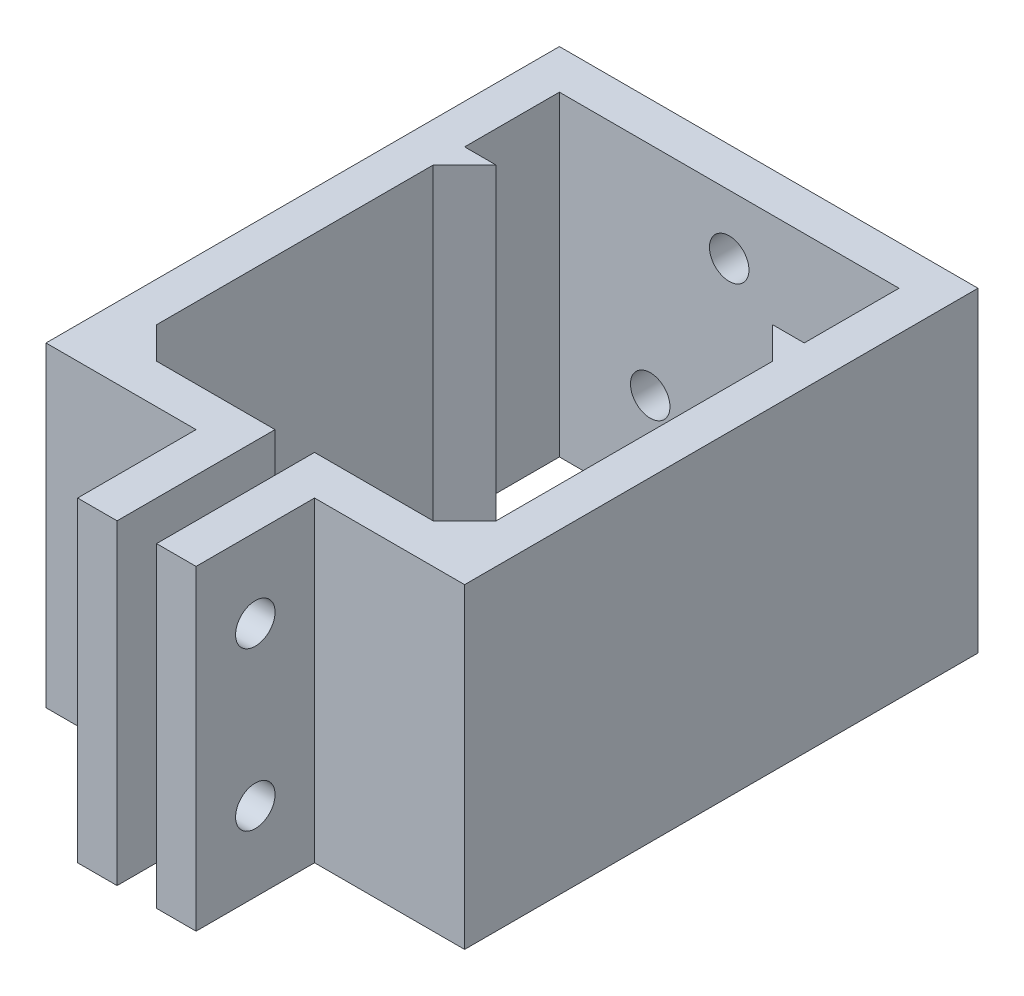
ISO-10303-21;
HEADER;
FILE_DESCRIPTION(('STEP AP214'),'2;1');
FILE_NAME('part.step','',(''),(''),'','','');
FILE_SCHEMA(('AUTOMOTIVE_DESIGN { 1 0 10303 214 1 1 1 1 }'));
ENDSEC;
DATA;
#1=APPLICATION_CONTEXT('core data for automotive mechanical design processes');
#2=APPLICATION_PROTOCOL_DEFINITION('international standard','automotive_design',2000,#1);
#3=PRODUCT_CONTEXT('',#1,'mechanical');
#4=PRODUCT('Part','Part','',(#3));
#5=PRODUCT_RELATED_PRODUCT_CATEGORY('part','',(#4));
#6=PRODUCT_DEFINITION_FORMATION('','',#4);
#7=PRODUCT_DEFINITION_CONTEXT('part definition',#1,'design');
#8=PRODUCT_DEFINITION('design','',#6,#7);
#9=PRODUCT_DEFINITION_SHAPE('','',#8);
#10=(LENGTH_UNIT() NAMED_UNIT(*) SI_UNIT(.MILLI.,.METRE.));
#11=(NAMED_UNIT(*) PLANE_ANGLE_UNIT() SI_UNIT($,.RADIAN.));
#12=(NAMED_UNIT(*) SI_UNIT($,.STERADIAN.) SOLID_ANGLE_UNIT());
#13=UNCERTAINTY_MEASURE_WITH_UNIT(LENGTH_MEASURE(1.E-05),#10,'distance_accuracy_value','');
#14=(GEOMETRIC_REPRESENTATION_CONTEXT(3) GLOBAL_UNCERTAINTY_ASSIGNED_CONTEXT((#13)) GLOBAL_UNIT_ASSIGNED_CONTEXT((#10,
#11,#12)) REPRESENTATION_CONTEXT('',''));
#15=CARTESIAN_POINT('',(0.,0.,0.));
#16=DIRECTION('',(0.,0.,1.));
#17=DIRECTION('',(1.,0.,0.));
#18=AXIS2_PLACEMENT_3D('',#15,#16,#17);
#19=CARTESIAN_POINT('',(48.,40.,-5.));
#20=DIRECTION('',(1.,0.,0.));
#21=DIRECTION('',(0.,0.,-1.));
#22=AXIS2_PLACEMENT_3D('',#19,#20,#21);
#23=PLANE('',#22);
#24=DIRECTION('',(0.,-1.,0.));
#25=VECTOR('',#24,1.);
#26=CARTESIAN_POINT('',(48.,40.,-48.));
#27=LINE('',#26,#25);
#28=CARTESIAN_POINT('',(48.,40.,-48.));
#29=VERTEX_POINT('',#28);
#30=CARTESIAN_POINT('',(48.,0.,-48.));
#31=VERTEX_POINT('',#30);
#32=EDGE_CURVE('E54',#29,#31,#27,.T.);
#33=ORIENTED_EDGE('',*,*,#32,.F.);
#34=DIRECTION('',(0.,0.,1.));
#35=VECTOR('',#34,1.);
#36=CARTESIAN_POINT('',(48.,40.,-5.));
#37=LINE('',#36,#35);
#38=CARTESIAN_POINT('',(48.,40.,-60.));
#39=VERTEX_POINT('',#38);
#40=EDGE_CURVE('E207',#39,#29,#37,.T.);
#41=ORIENTED_EDGE('',*,*,#40,.F.);
#42=DIRECTION('',(0.,-1.,0.));
#43=VECTOR('',#42,1.);
#44=CARTESIAN_POINT('',(48.,40.,-60.));
#45=LINE('',#44,#43);
#46=CARTESIAN_POINT('',(48.,0.,-60.));
#47=VERTEX_POINT('',#46);
#48=EDGE_CURVE('E351',#39,#47,#45,.T.);
#49=ORIENTED_EDGE('',*,*,#48,.T.);
#50=DIRECTION('',(0.,0.,1.));
#51=VECTOR('',#50,1.);
#52=CARTESIAN_POINT('',(48.,0.,-5.));
#53=LINE('',#52,#51);
#54=EDGE_CURVE('E311',#47,#31,#53,.T.);
#55=ORIENTED_EDGE('',*,*,#54,.T.);
#56=EDGE_LOOP('',(#33,#41,#49,#55));
#57=FACE_BOUND('',#56,.T.);
#58=ADVANCED_FACE('F31',(#57),#23,.F.);
#59=DIRECTION('',(0.,-1.,0.));
#60=VECTOR('',#59,1.);
#61=CARTESIAN_POINT('',(48.,40.,-44.));
#62=LINE('',#61,#60);
#63=CARTESIAN_POINT('',(48.,40.,-44.));
#64=VERTEX_POINT('',#63);
#65=CARTESIAN_POINT('',(48.,0.,-44.));
#66=VERTEX_POINT('',#65);
#67=EDGE_CURVE('E200',#64,#66,#62,.T.);
#68=ORIENTED_EDGE('',*,*,#67,.T.);
#69=CARTESIAN_POINT('',(48.,0.,-8.99999999999999));
#70=VERTEX_POINT('',#69);
#71=EDGE_CURVE('E310',#66,#70,#53,.T.);
#72=ORIENTED_EDGE('',*,*,#71,.T.);
#73=DIRECTION('',(0.,1.,0.));
#74=VECTOR('',#73,1.);
#75=CARTESIAN_POINT('',(48.,40.,-8.99999999999999));
#76=LINE('',#75,#74);
#77=CARTESIAN_POINT('',(48.,40.,-8.99999999999999));
#78=VERTEX_POINT('',#77);
#79=EDGE_CURVE('E372',#70,#78,#76,.T.);
#80=ORIENTED_EDGE('',*,*,#79,.T.);
#81=EDGE_CURVE('E46',#64,#78,#37,.T.);
#82=ORIENTED_EDGE('',*,*,#81,.F.);
#83=EDGE_LOOP('',(#68,#72,#80,#82));
#84=FACE_BOUND('',#83,.T.);
#85=ADVANCED_FACE('F418',(#84),#23,.F.);
#86=CARTESIAN_POINT('',(5.,40.,-60.));
#87=DIRECTION('',(-1.,0.,0.));
#88=DIRECTION('',(0.,0.,1.));
#89=AXIS2_PLACEMENT_3D('',#86,#87,#88);
#90=PLANE('',#89);
#91=DIRECTION('',(0.,-1.,0.));
#92=VECTOR('',#91,1.);
#93=CARTESIAN_POINT('',(5.,40.,-44.));
#94=LINE('',#93,#92);
#95=CARTESIAN_POINT('',(5.,40.,-44.));
#96=VERTEX_POINT('',#95);
#97=CARTESIAN_POINT('',(5.,0.,-44.));
#98=VERTEX_POINT('',#97);
#99=EDGE_CURVE('E227',#96,#98,#94,.T.);
#100=ORIENTED_EDGE('',*,*,#99,.F.);
#101=DIRECTION('',(0.,0.,-1.));
#102=VECTOR('',#101,1.);
#103=CARTESIAN_POINT('',(5.,40.,-60.));
#104=LINE('',#103,#102);
#105=CARTESIAN_POINT('',(5.,40.,-9.00000000000004));
#106=VERTEX_POINT('',#105);
#107=EDGE_CURVE('E271',#106,#96,#104,.T.);
#108=ORIENTED_EDGE('',*,*,#107,.F.);
#109=DIRECTION('',(0.,-1.,0.));
#110=VECTOR('',#109,1.);
#111=CARTESIAN_POINT('',(5.,0.,-9.00000000000004));
#112=LINE('',#111,#110);
#113=CARTESIAN_POINT('',(5.,0.,-9.00000000000004));
#114=VERTEX_POINT('',#113);
#115=EDGE_CURVE('E374',#106,#114,#112,.T.);
#116=ORIENTED_EDGE('',*,*,#115,.T.);
#117=DIRECTION('',(0.,0.,-1.));
#118=VECTOR('',#117,1.);
#119=CARTESIAN_POINT('',(5.,0.,-60.));
#120=LINE('',#119,#118);
#121=EDGE_CURVE('E306',#114,#98,#120,.T.);
#122=ORIENTED_EDGE('',*,*,#121,.T.);
#123=EDGE_LOOP('',(#100,#108,#116,#122));
#124=FACE_BOUND('',#123,.T.);
#125=ADVANCED_FACE('F401',(#124),#90,.F.);
#126=DIRECTION('',(0.,-1.,0.));
#127=VECTOR('',#126,1.);
#128=CARTESIAN_POINT('',(5.,40.,-48.));
#129=LINE('',#128,#127);
#130=CARTESIAN_POINT('',(5.,40.,-48.));
#131=VERTEX_POINT('',#130);
#132=CARTESIAN_POINT('',(5.,0.,-48.));
#133=VERTEX_POINT('',#132);
#134=EDGE_CURVE('E233',#131,#133,#129,.T.);
#135=ORIENTED_EDGE('',*,*,#134,.T.);
#136=CARTESIAN_POINT('',(5.,0.,-60.));
#137=VERTEX_POINT('',#136);
#138=EDGE_CURVE('E305',#133,#137,#120,.T.);
#139=ORIENTED_EDGE('',*,*,#138,.T.);
#140=DIRECTION('',(0.,-1.,0.));
#141=VECTOR('',#140,1.);
#142=CARTESIAN_POINT('',(5.,40.,-60.));
#143=LINE('',#142,#141);
#144=CARTESIAN_POINT('',(5.,40.,-60.));
#145=VERTEX_POINT('',#144);
#146=EDGE_CURVE('E354',#145,#137,#143,.T.);
#147=ORIENTED_EDGE('',*,*,#146,.F.);
#148=EDGE_CURVE('E270',#131,#145,#104,.T.);
#149=ORIENTED_EDGE('',*,*,#148,.F.);
#150=EDGE_LOOP('',(#135,#139,#147,#149));
#151=FACE_BOUND('',#150,.T.);
#152=ADVANCED_FACE('F413',(#151),#90,.F.);
#153=CARTESIAN_POINT('',(19.,40.,0.));
#154=DIRECTION('',(0.,0.,-1.));
#155=DIRECTION('',(-1.,0.,0.));
#156=AXIS2_PLACEMENT_3D('',#153,#154,#155);
#157=PLANE('',#156);
#158=DIRECTION('',(1.,0.,0.));
#159=VECTOR('',#158,1.);
#160=CARTESIAN_POINT('',(19.,0.,0.));
#161=LINE('',#160,#159);
#162=CARTESIAN_POINT('',(0.,0.,0.));
#163=VERTEX_POINT('',#162);
#164=CARTESIAN_POINT('',(19.,0.,0.));
#165=VERTEX_POINT('',#164);
#166=EDGE_CURVE('E257',#163,#165,#161,.T.);
#167=ORIENTED_EDGE('',*,*,#166,.T.);
#168=DIRECTION('',(0.,-1.,0.));
#169=VECTOR('',#168,1.);
#170=CARTESIAN_POINT('',(19.,40.,0.));
#171=LINE('',#170,#169);
#172=CARTESIAN_POINT('',(19.,40.,0.));
#173=VERTEX_POINT('',#172);
#174=EDGE_CURVE('E366',#173,#165,#171,.T.);
#175=ORIENTED_EDGE('',*,*,#174,.F.);
#176=DIRECTION('',(1.,0.,0.));
#177=VECTOR('',#176,1.);
#178=CARTESIAN_POINT('',(19.,40.,0.));
#179=LINE('',#178,#177);
#180=CARTESIAN_POINT('',(0.,40.,0.));
#181=VERTEX_POINT('',#180);
#182=EDGE_CURVE('E258',#181,#173,#179,.T.);
#183=ORIENTED_EDGE('',*,*,#182,.F.);
#184=DIRECTION('',(0.,-1.,0.));
#185=VECTOR('',#184,1.);
#186=CARTESIAN_POINT('',(0.,40.,0.));
#187=LINE('',#186,#185);
#188=EDGE_CURVE('E293',#181,#163,#187,.T.);
#189=ORIENTED_EDGE('',*,*,#188,.T.);
#190=EDGE_LOOP('',(#167,#175,#183,#189));
#191=FACE_BOUND('',#190,.T.);
#192=ADVANCED_FACE('F446',(#191),#157,.F.);
#193=CARTESIAN_POINT('',(19.,40.,15.));
#194=DIRECTION('',(1.,0.,0.));
#195=DIRECTION('',(0.,0.,-1.));
#196=AXIS2_PLACEMENT_3D('',#193,#194,#195);
#197=PLANE('',#196);
#198=CARTESIAN_POINT('',(19.,30.,7.5));
#199=DIRECTION('',(1.,0.,0.));
#200=DIRECTION('',(0.,0.,-1.));
#201=AXIS2_PLACEMENT_3D('',#198,#199,#200);
#202=CIRCLE('',#201,2.5);
#203=CARTESIAN_POINT('',(19.,30.,5.));
#204=VERTEX_POINT('',#203);
#205=EDGE_CURVE('E532',#204,#204,#202,.F.);
#206=ORIENTED_EDGE('',*,*,#205,.F.);
#207=EDGE_LOOP('',(#206));
#208=FACE_BOUND('',#207,.T.);
#209=CARTESIAN_POINT('',(19.,10.,7.5));
#210=DIRECTION('',(1.,0.,0.));
#211=DIRECTION('',(0.,0.,-1.));
#212=AXIS2_PLACEMENT_3D('',#209,#210,#211);
#213=CIRCLE('',#212,2.5);
#214=CARTESIAN_POINT('',(19.,10.,5.));
#215=VERTEX_POINT('',#214);
#216=EDGE_CURVE('E520',#215,#215,#213,.F.);
#217=ORIENTED_EDGE('',*,*,#216,.F.);
#218=EDGE_LOOP('',(#217));
#219=FACE_BOUND('',#218,.T.);
#220=DIRECTION('',(0.,0.,1.));
#221=VECTOR('',#220,1.);
#222=CARTESIAN_POINT('',(19.,0.,15.));
#223=LINE('',#222,#221);
#224=CARTESIAN_POINT('',(19.,0.,15.));
#225=VERTEX_POINT('',#224);
#226=EDGE_CURVE('E296',#165,#225,#223,.T.);
#227=ORIENTED_EDGE('',*,*,#226,.T.);
#228=DIRECTION('',(0.,-1.,0.));
#229=VECTOR('',#228,1.);
#230=CARTESIAN_POINT('',(19.,40.,15.));
#231=LINE('',#230,#229);
#232=CARTESIAN_POINT('',(19.,40.,15.));
#233=VERTEX_POINT('',#232);
#234=EDGE_CURVE('E363',#233,#225,#231,.T.);
#235=ORIENTED_EDGE('',*,*,#234,.F.);
#236=DIRECTION('',(0.,0.,1.));
#237=VECTOR('',#236,1.);
#238=CARTESIAN_POINT('',(19.,40.,15.));
#239=LINE('',#238,#237);
#240=EDGE_CURVE('E260',#173,#233,#239,.T.);
#241=ORIENTED_EDGE('',*,*,#240,.F.);
#242=ORIENTED_EDGE('',*,*,#174,.T.);
#243=EDGE_LOOP('',(#227,#235,#241,#242));
#244=FACE_BOUND('',#243,.T.);
#245=ADVANCED_FACE('F442',(#208,#219,#244),#197,.F.);
#246=CARTESIAN_POINT('',(24.,40.,15.));
#247=DIRECTION('',(0.,0.,-1.));
#248=DIRECTION('',(-1.,0.,0.));
#249=AXIS2_PLACEMENT_3D('',#246,#247,#248);
#250=PLANE('',#249);
#251=DIRECTION('',(1.,0.,0.));
#252=VECTOR('',#251,1.);
#253=CARTESIAN_POINT('',(24.,0.,15.));
#254=LINE('',#253,#252);
#255=CARTESIAN_POINT('',(24.,0.,15.));
#256=VERTEX_POINT('',#255);
#257=EDGE_CURVE('E298',#225,#256,#254,.T.);
#258=ORIENTED_EDGE('',*,*,#257,.T.);
#259=DIRECTION('',(0.,-1.,0.));
#260=VECTOR('',#259,1.);
#261=CARTESIAN_POINT('',(24.,40.,15.));
#262=LINE('',#261,#260);
#263=CARTESIAN_POINT('',(24.,40.,15.));
#264=VERTEX_POINT('',#263);
#265=EDGE_CURVE('E360',#264,#256,#262,.T.);
#266=ORIENTED_EDGE('',*,*,#265,.F.);
#267=DIRECTION('',(1.,0.,0.));
#268=VECTOR('',#267,1.);
#269=CARTESIAN_POINT('',(24.,40.,15.));
#270=LINE('',#269,#268);
#271=EDGE_CURVE('E263',#233,#264,#270,.T.);
#272=ORIENTED_EDGE('',*,*,#271,.F.);
#273=ORIENTED_EDGE('',*,*,#234,.T.);
#274=EDGE_LOOP('',(#258,#266,#272,#273));
#275=FACE_BOUND('',#274,.T.);
#276=ADVANCED_FACE('F438',(#275),#250,.F.);
#277=CARTESIAN_POINT('',(24.,40.,-5.));
#278=DIRECTION('',(-1.,0.,0.));
#279=DIRECTION('',(0.,0.,1.));
#280=AXIS2_PLACEMENT_3D('',#277,#278,#279);
#281=PLANE('',#280);
#282=CARTESIAN_POINT('',(24.,30.,7.5));
#283=DIRECTION('',(-1.,0.,0.));
#284=DIRECTION('',(0.,0.,1.));
#285=AXIS2_PLACEMENT_3D('',#282,#283,#284);
#286=CIRCLE('',#285,2.5);
#287=CARTESIAN_POINT('',(24.,30.,10.));
#288=VERTEX_POINT('',#287);
#289=EDGE_CURVE('E526',#288,#288,#286,.T.);
#290=ORIENTED_EDGE('',*,*,#289,.T.);
#291=EDGE_LOOP('',(#290));
#292=FACE_BOUND('',#291,.T.);
#293=CARTESIAN_POINT('',(24.,10.,7.5));
#294=DIRECTION('',(-1.,0.,0.));
#295=DIRECTION('',(0.,0.,1.));
#296=AXIS2_PLACEMENT_3D('',#293,#294,#295);
#297=CIRCLE('',#296,2.5);
#298=CARTESIAN_POINT('',(24.,10.,10.));
#299=VERTEX_POINT('',#298);
#300=EDGE_CURVE('E512',#299,#299,#297,.T.);
#301=ORIENTED_EDGE('',*,*,#300,.T.);
#302=EDGE_LOOP('',(#301));
#303=FACE_BOUND('',#302,.T.);
#304=DIRECTION('',(0.,0.,-1.));
#305=VECTOR('',#304,1.);
#306=CARTESIAN_POINT('',(24.,0.,-5.));
#307=LINE('',#306,#305);
#308=CARTESIAN_POINT('',(24.,0.,-5.));
#309=VERTEX_POINT('',#308);
#310=EDGE_CURVE('E300',#256,#309,#307,.T.);
#311=ORIENTED_EDGE('',*,*,#310,.T.);
#312=DIRECTION('',(0.,-1.,0.));
#313=VECTOR('',#312,1.);
#314=CARTESIAN_POINT('',(24.,40.,-5.));
#315=LINE('',#314,#313);
#316=CARTESIAN_POINT('',(24.,40.,-5.));
#317=VERTEX_POINT('',#316);
#318=EDGE_CURVE('E357',#317,#309,#315,.T.);
#319=ORIENTED_EDGE('',*,*,#318,.F.);
#320=DIRECTION('',(0.,0.,-1.));
#321=VECTOR('',#320,1.);
#322=CARTESIAN_POINT('',(24.,40.,-5.));
#323=LINE('',#322,#321);
#324=EDGE_CURVE('E265',#264,#317,#323,.T.);
#325=ORIENTED_EDGE('',*,*,#324,.F.);
#326=ORIENTED_EDGE('',*,*,#265,.T.);
#327=EDGE_LOOP('',(#311,#319,#325,#326));
#328=FACE_BOUND('',#327,.T.);
#329=ADVANCED_FACE('F435',(#292,#303,#328),#281,.F.);
#330=CARTESIAN_POINT('',(5.,40.,-5.));
#331=DIRECTION('',(0.,0.,1.));
#332=DIRECTION('',(1.,0.,0.));
#333=AXIS2_PLACEMENT_3D('',#330,#331,#332);
#334=PLANE('',#333);
#335=DIRECTION('',(-1.,0.,0.));
#336=VECTOR('',#335,1.);
#337=CARTESIAN_POINT('',(5.,0.,-5.));
#338=LINE('',#337,#336);
#339=CARTESIAN_POINT('',(8.99999999999999,0.,-5.));
#340=VERTEX_POINT('',#339);
#341=EDGE_CURVE('E302',#309,#340,#338,.T.);
#342=ORIENTED_EDGE('',*,*,#341,.T.);
#343=DIRECTION('',(0.,1.,0.));
#344=VECTOR('',#343,1.);
#345=CARTESIAN_POINT('',(8.99999999999999,40.,-5.));
#346=LINE('',#345,#344);
#347=CARTESIAN_POINT('',(8.99999999999999,40.,-5.));
#348=VERTEX_POINT('',#347);
#349=EDGE_CURVE('E377',#340,#348,#346,.T.);
#350=ORIENTED_EDGE('',*,*,#349,.T.);
#351=DIRECTION('',(-1.,0.,0.));
#352=VECTOR('',#351,1.);
#353=CARTESIAN_POINT('',(5.,40.,-5.));
#354=LINE('',#353,#352);
#355=EDGE_CURVE('E267',#317,#348,#354,.T.);
#356=ORIENTED_EDGE('',*,*,#355,.F.);
#357=ORIENTED_EDGE('',*,*,#318,.T.);
#358=EDGE_LOOP('',(#342,#350,#356,#357));
#359=FACE_BOUND('',#358,.T.);
#360=ADVANCED_FACE('F394',(#359),#334,.F.);
#361=CARTESIAN_POINT('',(48.,40.,-60.));
#362=DIRECTION('',(0.,0.,-1.));
#363=DIRECTION('',(-1.,0.,0.));
#364=AXIS2_PLACEMENT_3D('',#361,#362,#363);
#365=PLANE('',#364);
#366=CARTESIAN_POINT('',(16.5,12.5,-60.));
#367=DIRECTION('',(0.,0.,-1.));
#368=DIRECTION('',(-1.,0.,0.));
#369=AXIS2_PLACEMENT_3D('',#366,#367,#368);
#370=CIRCLE('',#369,2.5);
#371=CARTESIAN_POINT('',(14.,12.5,-60.));
#372=VERTEX_POINT('',#371);
#373=EDGE_CURVE('E239',#372,#372,#370,.F.);
#374=ORIENTED_EDGE('',*,*,#373,.F.);
#375=EDGE_LOOP('',(#374));
#376=FACE_BOUND('',#375,.T.);
#377=CARTESIAN_POINT('',(36.5,12.5,-60.));
#378=DIRECTION('',(0.,0.,-1.));
#379=DIRECTION('',(-1.,0.,0.));
#380=AXIS2_PLACEMENT_3D('',#377,#378,#379);
#381=CIRCLE('',#380,2.5);
#382=CARTESIAN_POINT('',(34.,12.5,-60.));
#383=VERTEX_POINT('',#382);
#384=EDGE_CURVE('E246',#383,#383,#381,.F.);
#385=ORIENTED_EDGE('',*,*,#384,.F.);
#386=EDGE_LOOP('',(#385));
#387=FACE_BOUND('',#386,.T.);
#388=CARTESIAN_POINT('',(26.5,32.5,-60.));
#389=DIRECTION('',(0.,0.,-1.));
#390=DIRECTION('',(-1.,0.,0.));
#391=AXIS2_PLACEMENT_3D('',#388,#389,#390);
#392=CIRCLE('',#391,2.5);
#393=CARTESIAN_POINT('',(24.,32.5,-60.));
#394=VERTEX_POINT('',#393);
#395=EDGE_CURVE('E254',#394,#394,#392,.F.);
#396=ORIENTED_EDGE('',*,*,#395,.F.);
#397=EDGE_LOOP('',(#396));
#398=FACE_BOUND('',#397,.T.);
#399=DIRECTION('',(1.,0.,0.));
#400=VECTOR('',#399,1.);
#401=CARTESIAN_POINT('',(48.,0.,-60.));
#402=LINE('',#401,#400);
#403=EDGE_CURVE('E308',#137,#47,#402,.T.);
#404=ORIENTED_EDGE('',*,*,#403,.T.);
#405=ORIENTED_EDGE('',*,*,#48,.F.);
#406=DIRECTION('',(1.,0.,0.));
#407=VECTOR('',#406,1.);
#408=CARTESIAN_POINT('',(48.,40.,-60.));
#409=LINE('',#408,#407);
#410=EDGE_CURVE('E274',#145,#39,#409,.T.);
#411=ORIENTED_EDGE('',*,*,#410,.F.);
#412=ORIENTED_EDGE('',*,*,#146,.T.);
#413=EDGE_LOOP('',(#404,#405,#411,#412));
#414=FACE_BOUND('',#413,.T.);
#415=ADVANCED_FACE('F415',(#376,#387,#398,#414),#365,.F.);
#416=CARTESIAN_POINT('',(29.,40.,-5.));
#417=DIRECTION('',(0.,0.,1.));
#418=DIRECTION('',(1.,0.,0.));
#419=AXIS2_PLACEMENT_3D('',#416,#417,#418);
#420=PLANE('',#419);
#421=DIRECTION('',(-1.,0.,0.));
#422=VECTOR('',#421,1.);
#423=CARTESIAN_POINT('',(29.,40.,-5.));
#424=LINE('',#423,#422);
#425=CARTESIAN_POINT('',(44.,40.,-5.));
#426=VERTEX_POINT('',#425);
#427=CARTESIAN_POINT('',(29.,40.,-5.));
#428=VERTEX_POINT('',#427);
#429=EDGE_CURVE('E277',#426,#428,#424,.T.);
#430=ORIENTED_EDGE('',*,*,#429,.F.);
#431=DIRECTION('',(0.,-1.,0.));
#432=VECTOR('',#431,1.);
#433=CARTESIAN_POINT('',(44.,0.,-5.));
#434=LINE('',#433,#432);
#435=CARTESIAN_POINT('',(44.,0.,-5.));
#436=VERTEX_POINT('',#435);
#437=EDGE_CURVE('E369',#426,#436,#434,.T.);
#438=ORIENTED_EDGE('',*,*,#437,.T.);
#439=DIRECTION('',(-1.,0.,0.));
#440=VECTOR('',#439,1.);
#441=CARTESIAN_POINT('',(29.,0.,-5.));
#442=LINE('',#441,#440);
#443=CARTESIAN_POINT('',(29.,0.,-5.));
#444=VERTEX_POINT('',#443);
#445=EDGE_CURVE('E313',#436,#444,#442,.T.);
#446=ORIENTED_EDGE('',*,*,#445,.T.);
#447=DIRECTION('',(0.,-1.,0.));
#448=VECTOR('',#447,1.);
#449=CARTESIAN_POINT('',(29.,40.,-5.));
#450=LINE('',#449,#448);
#451=EDGE_CURVE('E348',#428,#444,#450,.T.);
#452=ORIENTED_EDGE('',*,*,#451,.F.);
#453=EDGE_LOOP('',(#430,#438,#446,#452));
#454=FACE_BOUND('',#453,.T.);
#455=ADVANCED_FACE('F426',(#454),#420,.F.);
#456=CARTESIAN_POINT('',(29.,40.,15.));
#457=DIRECTION('',(1.,0.,0.));
#458=DIRECTION('',(0.,0.,-1.));
#459=AXIS2_PLACEMENT_3D('',#456,#457,#458);
#460=PLANE('',#459);
#461=CARTESIAN_POINT('',(29.,30.,7.5));
#462=DIRECTION('',(1.,0.,0.));
#463=DIRECTION('',(0.,0.,-1.));
#464=AXIS2_PLACEMENT_3D('',#461,#462,#463);
#465=CIRCLE('',#464,2.5);
#466=CARTESIAN_POINT('',(29.,30.,5.));
#467=VERTEX_POINT('',#466);
#468=EDGE_CURVE('E529',#467,#467,#465,.T.);
#469=ORIENTED_EDGE('',*,*,#468,.T.);
#470=EDGE_LOOP('',(#469));
#471=FACE_BOUND('',#470,.T.);
#472=CARTESIAN_POINT('',(29.,10.,7.5));
#473=DIRECTION('',(1.,0.,0.));
#474=DIRECTION('',(0.,0.,-1.));
#475=AXIS2_PLACEMENT_3D('',#472,#473,#474);
#476=CIRCLE('',#475,2.5);
#477=CARTESIAN_POINT('',(29.,10.,5.));
#478=VERTEX_POINT('',#477);
#479=EDGE_CURVE('E517',#478,#478,#476,.T.);
#480=ORIENTED_EDGE('',*,*,#479,.T.);
#481=EDGE_LOOP('',(#480));
#482=FACE_BOUND('',#481,.T.);
#483=DIRECTION('',(0.,0.,1.));
#484=VECTOR('',#483,1.);
#485=CARTESIAN_POINT('',(29.,0.,15.));
#486=LINE('',#485,#484);
#487=CARTESIAN_POINT('',(29.,0.,15.));
#488=VERTEX_POINT('',#487);
#489=EDGE_CURVE('E315',#444,#488,#486,.T.);
#490=ORIENTED_EDGE('',*,*,#489,.T.);
#491=DIRECTION('',(0.,-1.,0.));
#492=VECTOR('',#491,1.);
#493=CARTESIAN_POINT('',(29.,40.,15.));
#494=LINE('',#493,#492);
#495=CARTESIAN_POINT('',(29.,40.,15.));
#496=VERTEX_POINT('',#495);
#497=EDGE_CURVE('E345',#496,#488,#494,.T.);
#498=ORIENTED_EDGE('',*,*,#497,.F.);
#499=DIRECTION('',(0.,0.,1.));
#500=VECTOR('',#499,1.);
#501=CARTESIAN_POINT('',(29.,40.,15.));
#502=LINE('',#501,#500);
#503=EDGE_CURVE('E279',#428,#496,#502,.T.);
#504=ORIENTED_EDGE('',*,*,#503,.F.);
#505=ORIENTED_EDGE('',*,*,#451,.T.);
#506=EDGE_LOOP('',(#490,#498,#504,#505));
#507=FACE_BOUND('',#506,.T.);
#508=ADVANCED_FACE('F471',(#471,#482,#507),#460,.F.);
#509=CARTESIAN_POINT('',(34.,40.,15.));
#510=DIRECTION('',(0.,0.,-1.));
#511=DIRECTION('',(-1.,0.,0.));
#512=AXIS2_PLACEMENT_3D('',#509,#510,#511);
#513=PLANE('',#512);
#514=DIRECTION('',(1.,0.,0.));
#515=VECTOR('',#514,1.);
#516=CARTESIAN_POINT('',(34.,0.,15.));
#517=LINE('',#516,#515);
#518=CARTESIAN_POINT('',(34.,0.,15.));
#519=VERTEX_POINT('',#518);
#520=EDGE_CURVE('E317',#488,#519,#517,.T.);
#521=ORIENTED_EDGE('',*,*,#520,.T.);
#522=DIRECTION('',(0.,-1.,0.));
#523=VECTOR('',#522,1.);
#524=CARTESIAN_POINT('',(34.,40.,15.));
#525=LINE('',#524,#523);
#526=CARTESIAN_POINT('',(34.,40.,15.));
#527=VERTEX_POINT('',#526);
#528=EDGE_CURVE('E342',#527,#519,#525,.T.);
#529=ORIENTED_EDGE('',*,*,#528,.F.);
#530=DIRECTION('',(1.,0.,0.));
#531=VECTOR('',#530,1.);
#532=CARTESIAN_POINT('',(34.,40.,15.));
#533=LINE('',#532,#531);
#534=EDGE_CURVE('E281',#496,#527,#533,.T.);
#535=ORIENTED_EDGE('',*,*,#534,.F.);
#536=ORIENTED_EDGE('',*,*,#497,.T.);
#537=EDGE_LOOP('',(#521,#529,#535,#536));
#538=FACE_BOUND('',#537,.T.);
#539=ADVANCED_FACE('F477',(#538),#513,.F.);
#540=CARTESIAN_POINT('',(34.,40.,0.));
#541=DIRECTION('',(-1.,0.,0.));
#542=DIRECTION('',(0.,0.,1.));
#543=AXIS2_PLACEMENT_3D('',#540,#541,#542);
#544=PLANE('',#543);
#545=CARTESIAN_POINT('',(34.,30.,7.5));
#546=DIRECTION('',(1.,0.,0.));
#547=DIRECTION('',(0.,0.,-1.));
#548=AXIS2_PLACEMENT_3D('',#545,#546,#547);
#549=CIRCLE('',#548,2.5);
#550=CARTESIAN_POINT('',(34.,30.,5.));
#551=VERTEX_POINT('',#550);
#552=EDGE_CURVE('E535',#551,#551,#549,.T.);
#553=ORIENTED_EDGE('',*,*,#552,.F.);
#554=EDGE_LOOP('',(#553));
#555=FACE_BOUND('',#554,.T.);
#556=CARTESIAN_POINT('',(34.,10.,7.5));
#557=DIRECTION('',(1.,0.,0.));
#558=DIRECTION('',(0.,0.,-1.));
#559=AXIS2_PLACEMENT_3D('',#556,#557,#558);
#560=CIRCLE('',#559,2.5);
#561=CARTESIAN_POINT('',(34.,10.,5.));
#562=VERTEX_POINT('',#561);
#563=EDGE_CURVE('E523',#562,#562,#560,.T.);
#564=ORIENTED_EDGE('',*,*,#563,.F.);
#565=EDGE_LOOP('',(#564));
#566=FACE_BOUND('',#565,.T.);
#567=DIRECTION('',(0.,0.,-1.));
#568=VECTOR('',#567,1.);
#569=CARTESIAN_POINT('',(34.,0.,0.));
#570=LINE('',#569,#568);
#571=CARTESIAN_POINT('',(34.,0.,0.));
#572=VERTEX_POINT('',#571);
#573=EDGE_CURVE('E319',#519,#572,#570,.T.);
#574=ORIENTED_EDGE('',*,*,#573,.T.);
#575=DIRECTION('',(0.,-1.,0.));
#576=VECTOR('',#575,1.);
#577=CARTESIAN_POINT('',(34.,40.,0.));
#578=LINE('',#577,#576);
#579=CARTESIAN_POINT('',(34.,40.,0.));
#580=VERTEX_POINT('',#579);
#581=EDGE_CURVE('E339',#580,#572,#578,.T.);
#582=ORIENTED_EDGE('',*,*,#581,.F.);
#583=DIRECTION('',(0.,0.,-1.));
#584=VECTOR('',#583,1.);
#585=CARTESIAN_POINT('',(34.,40.,0.));
#586=LINE('',#585,#584);
#587=EDGE_CURVE('E283',#527,#580,#586,.T.);
#588=ORIENTED_EDGE('',*,*,#587,.F.);
#589=ORIENTED_EDGE('',*,*,#528,.T.);
#590=EDGE_LOOP('',(#574,#582,#588,#589));
#591=FACE_BOUND('',#590,.T.);
#592=ADVANCED_FACE('F481',(#555,#566,#591),#544,.F.);
#593=CARTESIAN_POINT('',(53.,40.,0.));
#594=DIRECTION('',(0.,0.,-1.));
#595=DIRECTION('',(-1.,0.,0.));
#596=AXIS2_PLACEMENT_3D('',#593,#594,#595);
#597=PLANE('',#596);
#598=DIRECTION('',(1.,0.,0.));
#599=VECTOR('',#598,1.);
#600=CARTESIAN_POINT('',(53.,0.,0.));
#601=LINE('',#600,#599);
#602=CARTESIAN_POINT('',(53.,0.,0.));
#603=VERTEX_POINT('',#602);
#604=EDGE_CURVE('E321',#572,#603,#601,.T.);
#605=ORIENTED_EDGE('',*,*,#604,.T.);
#606=DIRECTION('',(0.,-1.,0.));
#607=VECTOR('',#606,1.);
#608=CARTESIAN_POINT('',(53.,40.,0.));
#609=LINE('',#608,#607);
#610=CARTESIAN_POINT('',(53.,40.,0.));
#611=VERTEX_POINT('',#610);
#612=EDGE_CURVE('E336',#611,#603,#609,.T.);
#613=ORIENTED_EDGE('',*,*,#612,.F.);
#614=DIRECTION('',(1.,0.,0.));
#615=VECTOR('',#614,1.);
#616=CARTESIAN_POINT('',(53.,40.,0.));
#617=LINE('',#616,#615);
#618=EDGE_CURVE('E285',#580,#611,#617,.T.);
#619=ORIENTED_EDGE('',*,*,#618,.F.);
#620=ORIENTED_EDGE('',*,*,#581,.T.);
#621=EDGE_LOOP('',(#605,#613,#619,#620));
#622=FACE_BOUND('',#621,.T.);
#623=ADVANCED_FACE('F486',(#622),#597,.F.);
#624=CARTESIAN_POINT('',(53.,40.,-65.));
#625=DIRECTION('',(-1.,0.,0.));
#626=DIRECTION('',(0.,0.,1.));
#627=AXIS2_PLACEMENT_3D('',#624,#625,#626);
#628=PLANE('',#627);
#629=DIRECTION('',(0.,0.,-1.));
#630=VECTOR('',#629,1.);
#631=CARTESIAN_POINT('',(53.,0.,-65.));
#632=LINE('',#631,#630);
#633=CARTESIAN_POINT('',(53.,0.,-65.));
#634=VERTEX_POINT('',#633);
#635=EDGE_CURVE('E323',#603,#634,#632,.T.);
#636=ORIENTED_EDGE('',*,*,#635,.T.);
#637=DIRECTION('',(0.,-1.,0.));
#638=VECTOR('',#637,1.);
#639=CARTESIAN_POINT('',(53.,40.,-65.));
#640=LINE('',#639,#638);
#641=CARTESIAN_POINT('',(53.,40.,-65.));
#642=VERTEX_POINT('',#641);
#643=EDGE_CURVE('E333',#642,#634,#640,.T.);
#644=ORIENTED_EDGE('',*,*,#643,.F.);
#645=DIRECTION('',(0.,0.,-1.));
#646=VECTOR('',#645,1.);
#647=CARTESIAN_POINT('',(53.,40.,-65.));
#648=LINE('',#647,#646);
#649=EDGE_CURVE('E287',#611,#642,#648,.T.);
#650=ORIENTED_EDGE('',*,*,#649,.F.);
#651=ORIENTED_EDGE('',*,*,#612,.T.);
#652=EDGE_LOOP('',(#636,#644,#650,#651));
#653=FACE_BOUND('',#652,.T.);
#654=ADVANCED_FACE('F492',(#653),#628,.F.);
#655=CARTESIAN_POINT('',(0.,40.,-65.));
#656=DIRECTION('',(0.,0.,1.));
#657=DIRECTION('',(1.,0.,0.));
#658=AXIS2_PLACEMENT_3D('',#655,#656,#657);
#659=PLANE('',#658);
#660=CARTESIAN_POINT('',(16.5,12.5,-65.));
#661=DIRECTION('',(0.,0.,-1.));
#662=DIRECTION('',(-1.,0.,0.));
#663=AXIS2_PLACEMENT_3D('',#660,#661,#662);
#664=CIRCLE('',#663,2.5);
#665=CARTESIAN_POINT('',(14.,12.5,-65.));
#666=VERTEX_POINT('',#665);
#667=EDGE_CURVE('E242',#666,#666,#664,.T.);
#668=ORIENTED_EDGE('',*,*,#667,.F.);
#669=EDGE_LOOP('',(#668));
#670=FACE_BOUND('',#669,.T.);
#671=CARTESIAN_POINT('',(36.5,12.5,-65.));
#672=DIRECTION('',(0.,0.,-1.));
#673=DIRECTION('',(-1.,0.,0.));
#674=AXIS2_PLACEMENT_3D('',#671,#672,#673);
#675=CIRCLE('',#674,2.5);
#676=CARTESIAN_POINT('',(34.,12.5,-65.));
#677=VERTEX_POINT('',#676);
#678=EDGE_CURVE('E245',#677,#677,#675,.T.);
#679=ORIENTED_EDGE('',*,*,#678,.F.);
#680=EDGE_LOOP('',(#679));
#681=FACE_BOUND('',#680,.T.);
#682=CARTESIAN_POINT('',(26.5,32.5,-65.));
#683=DIRECTION('',(0.,0.,-1.));
#684=DIRECTION('',(-1.,0.,0.));
#685=AXIS2_PLACEMENT_3D('',#682,#683,#684);
#686=CIRCLE('',#685,2.5);
#687=CARTESIAN_POINT('',(24.,32.5,-65.));
#688=VERTEX_POINT('',#687);
#689=EDGE_CURVE('E249',#688,#688,#686,.T.);
#690=ORIENTED_EDGE('',*,*,#689,.F.);
#691=EDGE_LOOP('',(#690));
#692=FACE_BOUND('',#691,.T.);
#693=DIRECTION('',(-1.,0.,0.));
#694=VECTOR('',#693,1.);
#695=CARTESIAN_POINT('',(0.,0.,-65.));
#696=LINE('',#695,#694);
#697=CARTESIAN_POINT('',(0.,0.,-65.));
#698=VERTEX_POINT('',#697);
#699=EDGE_CURVE('E325',#634,#698,#696,.T.);
#700=ORIENTED_EDGE('',*,*,#699,.T.);
#701=DIRECTION('',(0.,-1.,0.));
#702=VECTOR('',#701,1.);
#703=CARTESIAN_POINT('',(0.,40.,-65.));
#704=LINE('',#703,#702);
#705=CARTESIAN_POINT('',(0.,40.,-65.));
#706=VERTEX_POINT('',#705);
#707=EDGE_CURVE('E330',#706,#698,#704,.T.);
#708=ORIENTED_EDGE('',*,*,#707,.F.);
#709=DIRECTION('',(-1.,0.,0.));
#710=VECTOR('',#709,1.);
#711=CARTESIAN_POINT('',(0.,40.,-65.));
#712=LINE('',#711,#710);
#713=EDGE_CURVE('E289',#642,#706,#712,.T.);
#714=ORIENTED_EDGE('',*,*,#713,.F.);
#715=ORIENTED_EDGE('',*,*,#643,.T.);
#716=EDGE_LOOP('',(#700,#708,#714,#715));
#717=FACE_BOUND('',#716,.T.);
#718=ADVANCED_FACE('F496',(#670,#681,#692,#717),#659,.F.);
#719=CARTESIAN_POINT('',(0.,40.,0.));
#720=DIRECTION('',(1.,0.,0.));
#721=DIRECTION('',(0.,0.,-1.));
#722=AXIS2_PLACEMENT_3D('',#719,#720,#721);
#723=PLANE('',#722);
#724=DIRECTION('',(0.,0.,1.));
#725=VECTOR('',#724,1.);
#726=CARTESIAN_POINT('',(0.,0.,0.));
#727=LINE('',#726,#725);
#728=EDGE_CURVE('E261',#698,#163,#727,.T.);
#729=ORIENTED_EDGE('',*,*,#728,.T.);
#730=ORIENTED_EDGE('',*,*,#188,.F.);
#731=DIRECTION('',(0.,0.,1.));
#732=VECTOR('',#731,1.);
#733=CARTESIAN_POINT('',(0.,40.,0.));
#734=LINE('',#733,#732);
#735=EDGE_CURVE('E291',#706,#181,#734,.T.);
#736=ORIENTED_EDGE('',*,*,#735,.F.);
#737=ORIENTED_EDGE('',*,*,#707,.T.);
#738=EDGE_LOOP('',(#729,#730,#736,#737));
#739=FACE_BOUND('',#738,.T.);
#740=ADVANCED_FACE('F501',(#739),#723,.F.);
#741=CARTESIAN_POINT('',(0.,40.,0.));
#742=DIRECTION('',(0.,-1.,0.));
#743=DIRECTION('',(0.,0.,-1.));
#744=AXIS2_PLACEMENT_3D('',#741,#742,#743);
#745=PLANE('',#744);
#746=ORIENTED_EDGE('',*,*,#182,.T.);
#747=ORIENTED_EDGE('',*,*,#240,.T.);
#748=ORIENTED_EDGE('',*,*,#271,.T.);
#749=ORIENTED_EDGE('',*,*,#324,.T.);
#750=ORIENTED_EDGE('',*,*,#355,.T.);
#751=DIRECTION('',(0.707106781186544,0.,0.707106781186552));
#752=VECTOR('',#751,1.);
#753=CARTESIAN_POINT('',(7.00000000000005,40.,-6.99999999999997));
#754=LINE('',#753,#752);
#755=EDGE_CURVE('E11',#348,#106,#754,.F.);
#756=ORIENTED_EDGE('',*,*,#755,.T.);
#757=ORIENTED_EDGE('',*,*,#107,.T.);
#758=DIRECTION('',(0.707106781186547,0.,-0.707106781186548));
#759=VECTOR('',#758,1.);
#760=CARTESIAN_POINT('',(9.00000000000001,40.,-48.));
#761=LINE('',#760,#759);
#762=CARTESIAN_POINT('',(9.00000000000001,40.,-48.));
#763=VERTEX_POINT('',#762);
#764=EDGE_CURVE('E222',#96,#763,#761,.T.);
#765=ORIENTED_EDGE('',*,*,#764,.T.);
#766=DIRECTION('',(-1.,0.,0.));
#767=VECTOR('',#766,1.);
#768=CARTESIAN_POINT('',(5.,40.,-48.));
#769=LINE('',#768,#767);
#770=EDGE_CURVE('E225',#763,#131,#769,.T.);
#771=ORIENTED_EDGE('',*,*,#770,.T.);
#772=ORIENTED_EDGE('',*,*,#148,.T.);
#773=ORIENTED_EDGE('',*,*,#410,.T.);
#774=ORIENTED_EDGE('',*,*,#40,.T.);
#775=DIRECTION('',(-1.,0.,0.));
#776=VECTOR('',#775,1.);
#777=CARTESIAN_POINT('',(48.,40.,-48.));
#778=LINE('',#777,#776);
#779=CARTESIAN_POINT('',(44.,40.,-48.));
#780=VERTEX_POINT('',#779);
#781=EDGE_CURVE('E202',#29,#780,#778,.T.);
#782=ORIENTED_EDGE('',*,*,#781,.T.);
#783=DIRECTION('',(0.707106781186547,0.,0.707106781186547));
#784=VECTOR('',#783,1.);
#785=CARTESIAN_POINT('',(44.,40.,-48.));
#786=LINE('',#785,#784);
#787=EDGE_CURVE('E193',#780,#64,#786,.T.);
#788=ORIENTED_EDGE('',*,*,#787,.T.);
#789=ORIENTED_EDGE('',*,*,#81,.T.);
#790=DIRECTION('',(0.707106781186551,0.,-0.707106781186544));
#791=VECTOR('',#790,1.);
#792=CARTESIAN_POINT('',(19.4999999999998,40.,19.5));
#793=LINE('',#792,#791);
#794=EDGE_CURVE('E382',#78,#426,#793,.F.);
#795=ORIENTED_EDGE('',*,*,#794,.T.);
#796=ORIENTED_EDGE('',*,*,#429,.T.);
#797=ORIENTED_EDGE('',*,*,#503,.T.);
#798=ORIENTED_EDGE('',*,*,#534,.T.);
#799=ORIENTED_EDGE('',*,*,#587,.T.);
#800=ORIENTED_EDGE('',*,*,#618,.T.);
#801=ORIENTED_EDGE('',*,*,#649,.T.);
#802=ORIENTED_EDGE('',*,*,#713,.T.);
#803=ORIENTED_EDGE('',*,*,#735,.T.);
#804=EDGE_LOOP('',(#746,#747,#748,#749,#750,#756,#757,#765,#771,#772,#773,#774,#782,#788,#789,
#795,#796,#797,#798,#799,#800,#801,#802,#803));
#805=FACE_BOUND('',#804,.T.);
#806=ADVANCED_FACE('F206',(#805),#745,.F.);
#807=CARTESIAN_POINT('',(0.,0.,0.));
#808=DIRECTION('',(0.,-1.,0.));
#809=DIRECTION('',(0.,0.,-1.));
#810=AXIS2_PLACEMENT_3D('',#807,#808,#809);
#811=PLANE('',#810);
#812=ORIENTED_EDGE('',*,*,#166,.F.);
#813=ORIENTED_EDGE('',*,*,#728,.F.);
#814=ORIENTED_EDGE('',*,*,#699,.F.);
#815=ORIENTED_EDGE('',*,*,#635,.F.);
#816=ORIENTED_EDGE('',*,*,#604,.F.);
#817=ORIENTED_EDGE('',*,*,#573,.F.);
#818=ORIENTED_EDGE('',*,*,#520,.F.);
#819=ORIENTED_EDGE('',*,*,#489,.F.);
#820=ORIENTED_EDGE('',*,*,#445,.F.);
#821=DIRECTION('',(-0.707106781186551,0.,0.707106781186544));
#822=VECTOR('',#821,1.);
#823=CARTESIAN_POINT('',(44.,0.,-5.));
#824=LINE('',#823,#822);
#825=EDGE_CURVE('E379',#436,#70,#824,.F.);
#826=ORIENTED_EDGE('',*,*,#825,.T.);
#827=ORIENTED_EDGE('',*,*,#71,.F.);
#828=DIRECTION('',(0.707106781186547,0.,0.707106781186547));
#829=VECTOR('',#828,1.);
#830=CARTESIAN_POINT('',(44.,0.,-48.));
#831=LINE('',#830,#829);
#832=CARTESIAN_POINT('',(44.,0.,-48.));
#833=VERTEX_POINT('',#832);
#834=EDGE_CURVE('E209',#833,#66,#831,.T.);
#835=ORIENTED_EDGE('',*,*,#834,.F.);
#836=DIRECTION('',(-1.,0.,0.));
#837=VECTOR('',#836,1.);
#838=CARTESIAN_POINT('',(48.,0.,-48.));
#839=LINE('',#838,#837);
#840=EDGE_CURVE('E213',#31,#833,#839,.T.);
#841=ORIENTED_EDGE('',*,*,#840,.F.);
#842=ORIENTED_EDGE('',*,*,#54,.F.);
#843=ORIENTED_EDGE('',*,*,#403,.F.);
#844=ORIENTED_EDGE('',*,*,#138,.F.);
#845=DIRECTION('',(-1.,0.,0.));
#846=VECTOR('',#845,1.);
#847=CARTESIAN_POINT('',(5.,0.,-48.));
#848=LINE('',#847,#846);
#849=CARTESIAN_POINT('',(9.00000000000001,0.,-48.));
#850=VERTEX_POINT('',#849);
#851=EDGE_CURVE('E217',#850,#133,#848,.T.);
#852=ORIENTED_EDGE('',*,*,#851,.F.);
#853=DIRECTION('',(0.707106781186547,0.,-0.707106781186548));
#854=VECTOR('',#853,1.);
#855=CARTESIAN_POINT('',(9.00000000000001,0.,-48.));
#856=LINE('',#855,#854);
#857=EDGE_CURVE('E214',#98,#850,#856,.T.);
#858=ORIENTED_EDGE('',*,*,#857,.F.);
#859=ORIENTED_EDGE('',*,*,#121,.F.);
#860=DIRECTION('',(-0.707106781186544,0.,-0.707106781186552));
#861=VECTOR('',#860,1.);
#862=CARTESIAN_POINT('',(5.,0.,-9.00000000000004));
#863=LINE('',#862,#861);
#864=EDGE_CURVE('E39',#114,#340,#863,.F.);
#865=ORIENTED_EDGE('',*,*,#864,.T.);
#866=ORIENTED_EDGE('',*,*,#341,.F.);
#867=ORIENTED_EDGE('',*,*,#310,.F.);
#868=ORIENTED_EDGE('',*,*,#257,.F.);
#869=ORIENTED_EDGE('',*,*,#226,.F.);
#870=EDGE_LOOP('',(#812,#813,#814,#815,#816,#817,#818,#819,#820,#826,#827,#835,#841,#842,#843,
#844,#852,#858,#859,#865,#866,#867,#868,#869));
#871=FACE_BOUND('',#870,.T.);
#872=ADVANCED_FACE('F387',(#871),#811,.T.);
#873=CARTESIAN_POINT('',(44.,40.,-5.));
#874=DIRECTION('',(-0.707106781186544,0.,-0.707106781186551));
#875=DIRECTION('',(-0.707106781186551,0.,0.707106781186544));
#876=AXIS2_PLACEMENT_3D('',#873,#874,#875);
#877=PLANE('',#876);
#878=ORIENTED_EDGE('',*,*,#794,.F.);
#879=ORIENTED_EDGE('',*,*,#79,.F.);
#880=ORIENTED_EDGE('',*,*,#825,.F.);
#881=ORIENTED_EDGE('',*,*,#437,.F.);
#882=EDGE_LOOP('',(#878,#879,#880,#881));
#883=FACE_BOUND('',#882,.T.);
#884=ADVANCED_FACE('F450',(#883),#877,.T.);
#885=CARTESIAN_POINT('',(5.,40.,-9.00000000000004));
#886=DIRECTION('',(0.707106781186552,0.,-0.707106781186544));
#887=DIRECTION('',(-0.707106781186544,0.,-0.707106781186552));
#888=AXIS2_PLACEMENT_3D('',#885,#886,#887);
#889=PLANE('',#888);
#890=ORIENTED_EDGE('',*,*,#755,.F.);
#891=ORIENTED_EDGE('',*,*,#349,.F.);
#892=ORIENTED_EDGE('',*,*,#864,.F.);
#893=ORIENTED_EDGE('',*,*,#115,.F.);
#894=EDGE_LOOP('',(#890,#891,#892,#893));
#895=FACE_BOUND('',#894,.T.);
#896=ADVANCED_FACE('F33',(#895),#889,.T.);
#897=CARTESIAN_POINT('',(26.5,32.5,15.001));
#898=DIRECTION('',(0.,0.,-1.));
#899=DIRECTION('',(-1.,0.,0.));
#900=AXIS2_PLACEMENT_3D('',#897,#898,#899);
#901=CYLINDRICAL_SURFACE('',#900,2.5);
#902=ORIENTED_EDGE('',*,*,#689,.T.);
#903=EDGE_LOOP('',(#902));
#904=FACE_BOUND('',#903,.T.);
#905=ORIENTED_EDGE('',*,*,#395,.T.);
#906=EDGE_LOOP('',(#905));
#907=FACE_BOUND('',#906,.T.);
#908=ADVANCED_FACE('F457',(#904,#907),#901,.F.);
#909=CARTESIAN_POINT('',(36.5,12.5,15.001));
#910=DIRECTION('',(0.,0.,-1.));
#911=DIRECTION('',(-1.,0.,0.));
#912=AXIS2_PLACEMENT_3D('',#909,#910,#911);
#913=CYLINDRICAL_SURFACE('',#912,2.5);
#914=ORIENTED_EDGE('',*,*,#678,.T.);
#915=EDGE_LOOP('',(#914));
#916=FACE_BOUND('',#915,.T.);
#917=ORIENTED_EDGE('',*,*,#384,.T.);
#918=EDGE_LOOP('',(#917));
#919=FACE_BOUND('',#918,.T.);
#920=ADVANCED_FACE('F574',(#916,#919),#913,.F.);
#921=CARTESIAN_POINT('',(16.5,12.5,15.001));
#922=DIRECTION('',(0.,0.,-1.));
#923=DIRECTION('',(-1.,0.,0.));
#924=AXIS2_PLACEMENT_3D('',#921,#922,#923);
#925=CYLINDRICAL_SURFACE('',#924,2.5);
#926=ORIENTED_EDGE('',*,*,#667,.T.);
#927=EDGE_LOOP('',(#926));
#928=FACE_BOUND('',#927,.T.);
#929=ORIENTED_EDGE('',*,*,#373,.T.);
#930=EDGE_LOOP('',(#929));
#931=FACE_BOUND('',#930,.T.);
#932=ADVANCED_FACE('F578',(#928,#931),#925,.F.);
#933=CARTESIAN_POINT('',(9.00000000000001,40.,-48.));
#934=DIRECTION('',(-0.707106781186548,0.,-0.707106781186547));
#935=DIRECTION('',(-0.707106781186547,0.,0.707106781186548));
#936=AXIS2_PLACEMENT_3D('',#933,#934,#935);
#937=PLANE('',#936);
#938=ORIENTED_EDGE('',*,*,#857,.T.);
#939=DIRECTION('',(0.,-1.,0.));
#940=VECTOR('',#939,1.);
#941=CARTESIAN_POINT('',(9.00000000000001,40.,-48.));
#942=LINE('',#941,#940);
#943=EDGE_CURVE('E236',#763,#850,#942,.T.);
#944=ORIENTED_EDGE('',*,*,#943,.F.);
#945=ORIENTED_EDGE('',*,*,#764,.F.);
#946=ORIENTED_EDGE('',*,*,#99,.T.);
#947=EDGE_LOOP('',(#938,#944,#945,#946));
#948=FACE_BOUND('',#947,.T.);
#949=ADVANCED_FACE('F403',(#948),#937,.F.);
#950=CARTESIAN_POINT('',(5.,40.,-48.));
#951=DIRECTION('',(0.,0.,1.));
#952=DIRECTION('',(1.,0.,0.));
#953=AXIS2_PLACEMENT_3D('',#950,#951,#952);
#954=PLANE('',#953);
#955=ORIENTED_EDGE('',*,*,#851,.T.);
#956=ORIENTED_EDGE('',*,*,#134,.F.);
#957=ORIENTED_EDGE('',*,*,#770,.F.);
#958=ORIENTED_EDGE('',*,*,#943,.T.);
#959=EDGE_LOOP('',(#955,#956,#957,#958));
#960=FACE_BOUND('',#959,.T.);
#961=ADVANCED_FACE('F408',(#960),#954,.F.);
#962=CARTESIAN_POINT('',(48.,40.,-48.));
#963=DIRECTION('',(0.,0.,1.));
#964=DIRECTION('',(1.,0.,0.));
#965=AXIS2_PLACEMENT_3D('',#962,#963,#964);
#966=PLANE('',#965);
#967=ORIENTED_EDGE('',*,*,#840,.T.);
#968=DIRECTION('',(0.,-1.,0.));
#969=VECTOR('',#968,1.);
#970=CARTESIAN_POINT('',(44.,40.,-48.));
#971=LINE('',#970,#969);
#972=EDGE_CURVE('E198',#780,#833,#971,.T.);
#973=ORIENTED_EDGE('',*,*,#972,.F.);
#974=ORIENTED_EDGE('',*,*,#781,.F.);
#975=ORIENTED_EDGE('',*,*,#32,.T.);
#976=EDGE_LOOP('',(#967,#973,#974,#975));
#977=FACE_BOUND('',#976,.T.);
#978=ADVANCED_FACE('F211',(#977),#966,.F.);
#979=CARTESIAN_POINT('',(44.,40.,-48.));
#980=DIRECTION('',(0.707106781186548,0.,-0.707106781186548));
#981=DIRECTION('',(-0.707106781186548,0.,-0.707106781186548));
#982=AXIS2_PLACEMENT_3D('',#979,#980,#981);
#983=PLANE('',#982);
#984=ORIENTED_EDGE('',*,*,#834,.T.);
#985=ORIENTED_EDGE('',*,*,#67,.F.);
#986=ORIENTED_EDGE('',*,*,#787,.F.);
#987=ORIENTED_EDGE('',*,*,#972,.T.);
#988=EDGE_LOOP('',(#984,#985,#986,#987));
#989=FACE_BOUND('',#988,.T.);
#990=ADVANCED_FACE('F196',(#989),#983,.F.);
#991=CARTESIAN_POINT('',(11.9289321881345,10.,7.5));
#992=DIRECTION('',(1.,0.,0.));
#993=DIRECTION('',(0.,0.,-1.));
#994=AXIS2_PLACEMENT_3D('',#991,#992,#993);
#995=CYLINDRICAL_SURFACE('',#994,2.5);
#996=ORIENTED_EDGE('',*,*,#563,.T.);
#997=EDGE_LOOP('',(#996));
#998=FACE_BOUND('',#997,.T.);
#999=ORIENTED_EDGE('',*,*,#479,.F.);
#1000=EDGE_LOOP('',(#999));
#1001=FACE_BOUND('',#1000,.T.);
#1002=ADVANCED_FACE('F547',(#998,#1001),#995,.F.);
#1003=ORIENTED_EDGE('',*,*,#216,.T.);
#1004=EDGE_LOOP('',(#1003));
#1005=FACE_BOUND('',#1004,.T.);
#1006=ORIENTED_EDGE('',*,*,#300,.F.);
#1007=EDGE_LOOP('',(#1006));
#1008=FACE_BOUND('',#1007,.T.);
#1009=ADVANCED_FACE('F550',(#1005,#1008),#995,.F.);
#1010=CARTESIAN_POINT('',(11.9289321881345,30.,7.5));
#1011=DIRECTION('',(1.,0.,0.));
#1012=DIRECTION('',(0.,0.,-1.));
#1013=AXIS2_PLACEMENT_3D('',#1010,#1011,#1012);
#1014=CYLINDRICAL_SURFACE('',#1013,2.5);
#1015=ORIENTED_EDGE('',*,*,#552,.T.);
#1016=EDGE_LOOP('',(#1015));
#1017=FACE_BOUND('',#1016,.T.);
#1018=ORIENTED_EDGE('',*,*,#468,.F.);
#1019=EDGE_LOOP('',(#1018));
#1020=FACE_BOUND('',#1019,.T.);
#1021=ADVANCED_FACE('F539',(#1017,#1020),#1014,.F.);
#1022=ORIENTED_EDGE('',*,*,#205,.T.);
#1023=EDGE_LOOP('',(#1022));
#1024=FACE_BOUND('',#1023,.T.);
#1025=ORIENTED_EDGE('',*,*,#289,.F.);
#1026=EDGE_LOOP('',(#1025));
#1027=FACE_BOUND('',#1026,.T.);
#1028=ADVANCED_FACE('F593',(#1024,#1027),#1014,.F.);
#1029=CLOSED_SHELL('',(#58,#85,#125,#152,#192,#245,#276,#329,#360,#415,#455,#508,#539,#592,#623,
#654,#718,#740,#806,#872,#884,#896,#908,#920,#932,#949,#961,#978,#990,#1002,#1009,#1021,#1028));
#1030=MANIFOLD_SOLID_BREP('B2',#1029);
#1031=ADVANCED_BREP_SHAPE_REPRESENTATION('',(#18,#1030),#14);
#1032=SHAPE_DEFINITION_REPRESENTATION(#9,#1031);
ENDSEC;
END-ISO-10303-21;
